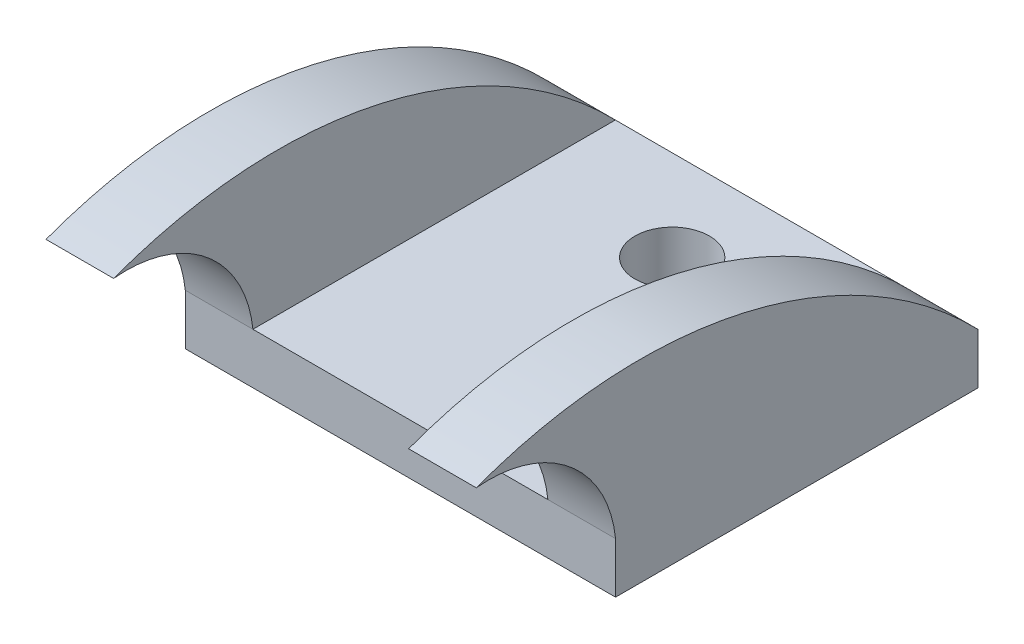
ISO-10303-21;
HEADER;
FILE_DESCRIPTION(('STEP AP214'),'2;1');
FILE_NAME('part.step','',(''),(''),'','','');
FILE_SCHEMA(('AUTOMOTIVE_DESIGN { 1 0 10303 214 1 1 1 1 }'));
ENDSEC;
DATA;
#1=APPLICATION_CONTEXT('core data for automotive mechanical design processes');
#2=APPLICATION_PROTOCOL_DEFINITION('international standard','automotive_design',2000,#1);
#3=PRODUCT_CONTEXT('',#1,'mechanical');
#4=PRODUCT('Part','Part','',(#3));
#5=PRODUCT_RELATED_PRODUCT_CATEGORY('part','',(#4));
#6=PRODUCT_DEFINITION_FORMATION('','',#4);
#7=PRODUCT_DEFINITION_CONTEXT('part definition',#1,'design');
#8=PRODUCT_DEFINITION('design','',#6,#7);
#9=PRODUCT_DEFINITION_SHAPE('','',#8);
#10=(LENGTH_UNIT() NAMED_UNIT(*) SI_UNIT(.MILLI.,.METRE.));
#11=(NAMED_UNIT(*) PLANE_ANGLE_UNIT() SI_UNIT($,.RADIAN.));
#12=(NAMED_UNIT(*) SI_UNIT($,.STERADIAN.) SOLID_ANGLE_UNIT());
#13=UNCERTAINTY_MEASURE_WITH_UNIT(LENGTH_MEASURE(1.E-05),#10,'distance_accuracy_value','');
#14=(GEOMETRIC_REPRESENTATION_CONTEXT(3) GLOBAL_UNCERTAINTY_ASSIGNED_CONTEXT((#13)) GLOBAL_UNIT_ASSIGNED_CONTEXT((#10,
#11,#12)) REPRESENTATION_CONTEXT('',''));
#15=CARTESIAN_POINT('',(0.,0.,0.));
#16=DIRECTION('',(0.,0.,1.));
#17=DIRECTION('',(1.,0.,0.));
#18=AXIS2_PLACEMENT_3D('',#15,#16,#17);
#19=CARTESIAN_POINT('',(0.,4.7625,0.));
#20=DIRECTION('',(0.,-1.,0.));
#21=DIRECTION('',(0.,0.,-1.));
#22=AXIS2_PLACEMENT_3D('',#19,#20,#21);
#23=PLANE('',#22);
#24=CARTESIAN_POINT('',(20.20062,4.7625,-25.5224165246659));
#25=DIRECTION('',(0.,1.,0.));
#26=DIRECTION('',(0.,0.,1.));
#27=AXIS2_PLACEMENT_3D('',#24,#25,#26);
#28=CIRCLE('',#27,3.5);
#29=CARTESIAN_POINT('',(20.20062,4.7625,-22.0224165246659));
#30=VERTEX_POINT('',#29);
#31=EDGE_CURVE('E161',#30,#30,#28,.T.);
#32=ORIENTED_EDGE('',*,*,#31,.F.);
#33=EDGE_LOOP('',(#32));
#34=FACE_BOUND('',#33,.T.);
#35=DIRECTION('',(-1.,0.,0.));
#36=VECTOR('',#35,1.);
#37=CARTESIAN_POINT('',(0.,4.7625,-34.036));
#38=LINE('',#37,#36);
#39=CARTESIAN_POINT('',(34.05124,4.7625,-34.036));
#40=VERTEX_POINT('',#39);
#41=CARTESIAN_POINT('',(6.35,4.7625,-34.036));
#42=VERTEX_POINT('',#41);
#43=EDGE_CURVE('E174',#40,#42,#38,.T.);
#44=ORIENTED_EDGE('',*,*,#43,.T.);
#45=DIRECTION('',(0.,0.,-1.));
#46=VECTOR('',#45,1.);
#47=CARTESIAN_POINT('',(6.35,4.7625,0.));
#48=LINE('',#47,#46);
#49=CARTESIAN_POINT('',(6.35,4.7625,0.));
#50=VERTEX_POINT('',#49);
#51=EDGE_CURVE('E57',#50,#42,#48,.T.);
#52=ORIENTED_EDGE('',*,*,#51,.F.);
#53=DIRECTION('',(1.,0.,0.));
#54=VECTOR('',#53,1.);
#55=CARTESIAN_POINT('',(0.,4.7625,0.));
#56=LINE('',#55,#54);
#57=CARTESIAN_POINT('',(34.05124,4.7625,0.));
#58=VERTEX_POINT('',#57);
#59=EDGE_CURVE('E175',#50,#58,#56,.T.);
#60=ORIENTED_EDGE('',*,*,#59,.T.);
#61=DIRECTION('',(0.,0.,-1.));
#62=VECTOR('',#61,1.);
#63=CARTESIAN_POINT('',(34.05124,4.7625,0.));
#64=LINE('',#63,#62);
#65=EDGE_CURVE('E149',#58,#40,#64,.T.);
#66=ORIENTED_EDGE('',*,*,#65,.T.);
#67=EDGE_LOOP('',(#44,#52,#60,#66));
#68=FACE_BOUND('',#67,.T.);
#69=ADVANCED_FACE('F41',(#34,#68),#23,.F.);
#70=CARTESIAN_POINT('',(0.,0.,0.));
#71=DIRECTION('',(0.,-1.,0.));
#72=DIRECTION('',(0.,0.,-1.));
#73=AXIS2_PLACEMENT_3D('',#70,#71,#72);
#74=PLANE('',#73);
#75=CARTESIAN_POINT('',(20.20062,0.,-25.5224165246659));
#76=DIRECTION('',(0.,1.,0.));
#77=DIRECTION('',(0.,0.,1.));
#78=AXIS2_PLACEMENT_3D('',#75,#76,#77);
#79=CIRCLE('',#78,3.5);
#80=CARTESIAN_POINT('',(20.20062,0.,-22.0224165246659));
#81=VERTEX_POINT('',#80);
#82=EDGE_CURVE('E167',#81,#81,#79,.T.);
#83=ORIENTED_EDGE('',*,*,#82,.T.);
#84=EDGE_LOOP('',(#83));
#85=FACE_BOUND('',#84,.T.);
#86=DIRECTION('',(0.,0.,1.));
#87=VECTOR('',#86,1.);
#88=CARTESIAN_POINT('',(0.,0.,0.));
#89=LINE('',#88,#87);
#90=CARTESIAN_POINT('',(0.,0.,-34.036));
#91=VERTEX_POINT('',#90);
#92=CARTESIAN_POINT('',(0.,0.,0.));
#93=VERTEX_POINT('',#92);
#94=EDGE_CURVE('E171',#91,#93,#89,.T.);
#95=ORIENTED_EDGE('',*,*,#94,.F.);
#96=DIRECTION('',(-1.,0.,0.));
#97=VECTOR('',#96,1.);
#98=CARTESIAN_POINT('',(0.,0.,-34.036));
#99=LINE('',#98,#97);
#100=CARTESIAN_POINT('',(40.40124,0.,-34.036));
#101=VERTEX_POINT('',#100);
#102=EDGE_CURVE('E190',#101,#91,#99,.T.);
#103=ORIENTED_EDGE('',*,*,#102,.F.);
#104=DIRECTION('',(0.,0.,-1.));
#105=VECTOR('',#104,1.);
#106=CARTESIAN_POINT('',(40.40124,0.,0.));
#107=LINE('',#106,#105);
#108=CARTESIAN_POINT('',(40.40124,0.,0.));
#109=VERTEX_POINT('',#108);
#110=EDGE_CURVE('E187',#109,#101,#107,.T.);
#111=ORIENTED_EDGE('',*,*,#110,.F.);
#112=DIRECTION('',(1.,0.,0.));
#113=VECTOR('',#112,1.);
#114=CARTESIAN_POINT('',(0.,0.,0.));
#115=LINE('',#114,#113);
#116=EDGE_CURVE('E184',#93,#109,#115,.T.);
#117=ORIENTED_EDGE('',*,*,#116,.F.);
#118=EDGE_LOOP('',(#95,#103,#111,#117));
#119=FACE_BOUND('',#118,.T.);
#120=ADVANCED_FACE('F210',(#85,#119),#74,.T.);
#121=CARTESIAN_POINT('',(0.,4.7625,0.));
#122=DIRECTION('',(1.,0.,0.));
#123=DIRECTION('',(0.,0.,-1.));
#124=AXIS2_PLACEMENT_3D('',#121,#122,#123);
#125=PLANE('',#124);
#126=ORIENTED_EDGE('',*,*,#94,.T.);
#127=DIRECTION('',(0.,-1.,0.));
#128=VECTOR('',#127,1.);
#129=CARTESIAN_POINT('',(0.,4.7625,0.));
#130=LINE('',#129,#128);
#131=CARTESIAN_POINT('',(0.,4.7625,0.));
#132=VERTEX_POINT('',#131);
#133=EDGE_CURVE('E11',#132,#93,#130,.T.);
#134=ORIENTED_EDGE('',*,*,#133,.F.);
#135=CARTESIAN_POINT('',(0.,3.49991612378801,11.924597944122));
#136=DIRECTION('',(-1.,0.,0.));
#137=DIRECTION('',(0.,0.,1.));
#138=AXIS2_PLACEMENT_3D('',#135,#136,#137);
#139=CIRCLE('',#138,11.991253236148);
#140=CARTESIAN_POINT('',(0.,15.4354816597309,13.0789070494494));
#141=VERTEX_POINT('',#140);
#142=EDGE_CURVE('E124',#141,#132,#139,.T.);
#143=ORIENTED_EDGE('',*,*,#142,.F.);
#144=CARTESIAN_POINT('',(0.,-26.0443619029989,-2.29096074080328));
#145=DIRECTION('',(1.,0.,0.));
#146=DIRECTION('',(0.,0.,1.));
#147=AXIS2_PLACEMENT_3D('',#144,#145,#146);
#148=CIRCLE('',#147,44.2358481085012);
#149=CARTESIAN_POINT('',(0.,4.7625,-34.036));
#150=VERTEX_POINT('',#149);
#151=EDGE_CURVE('E128',#150,#141,#148,.T.);
#152=ORIENTED_EDGE('',*,*,#151,.F.);
#153=DIRECTION('',(0.,-1.,0.));
#154=VECTOR('',#153,1.);
#155=CARTESIAN_POINT('',(0.,4.7625,-34.036));
#156=LINE('',#155,#154);
#157=EDGE_CURVE('E180',#150,#91,#156,.T.);
#158=ORIENTED_EDGE('',*,*,#157,.T.);
#159=EDGE_LOOP('',(#126,#134,#143,#152,#158));
#160=FACE_BOUND('',#159,.T.);
#161=ADVANCED_FACE('F43',(#160),#125,.F.);
#162=CARTESIAN_POINT('',(0.,4.7625,0.));
#163=DIRECTION('',(0.,0.,-1.));
#164=DIRECTION('',(-1.,0.,0.));
#165=AXIS2_PLACEMENT_3D('',#162,#163,#164);
#166=PLANE('',#165);
#167=ORIENTED_EDGE('',*,*,#116,.T.);
#168=DIRECTION('',(0.,-1.,0.));
#169=VECTOR('',#168,1.);
#170=CARTESIAN_POINT('',(40.40124,4.7625,0.));
#171=LINE('',#170,#169);
#172=CARTESIAN_POINT('',(40.40124,4.7625,0.));
#173=VERTEX_POINT('',#172);
#174=EDGE_CURVE('E50',#173,#109,#171,.T.);
#175=ORIENTED_EDGE('',*,*,#174,.F.);
#176=DIRECTION('',(1.,0.,0.));
#177=VECTOR('',#176,1.);
#178=CARTESIAN_POINT('',(34.05124,4.7625,0.));
#179=LINE('',#178,#177);
#180=EDGE_CURVE('E157',#58,#173,#179,.T.);
#181=ORIENTED_EDGE('',*,*,#180,.F.);
#182=ORIENTED_EDGE('',*,*,#59,.F.);
#183=EDGE_CURVE('E115',#132,#50,#56,.T.);
#184=ORIENTED_EDGE('',*,*,#183,.F.);
#185=ORIENTED_EDGE('',*,*,#133,.T.);
#186=EDGE_LOOP('',(#167,#175,#181,#182,#184,#185));
#187=FACE_BOUND('',#186,.T.);
#188=ADVANCED_FACE('F219',(#187),#166,.F.);
#189=CARTESIAN_POINT('',(40.40124,4.7625,0.));
#190=DIRECTION('',(-1.,0.,0.));
#191=DIRECTION('',(0.,0.,1.));
#192=AXIS2_PLACEMENT_3D('',#189,#190,#191);
#193=PLANE('',#192);
#194=ORIENTED_EDGE('',*,*,#110,.T.);
#195=DIRECTION('',(0.,-1.,0.));
#196=VECTOR('',#195,1.);
#197=CARTESIAN_POINT('',(40.40124,4.7625,-34.036));
#198=LINE('',#197,#196);
#199=CARTESIAN_POINT('',(40.40124,4.7625,-34.036));
#200=VERTEX_POINT('',#199);
#201=EDGE_CURVE('E196',#200,#101,#198,.T.);
#202=ORIENTED_EDGE('',*,*,#201,.F.);
#203=CARTESIAN_POINT('',(40.40124,-26.0443619029989,-2.29096074080328));
#204=DIRECTION('',(1.,0.,0.));
#205=DIRECTION('',(0.,0.,1.));
#206=AXIS2_PLACEMENT_3D('',#203,#204,#205);
#207=CIRCLE('',#206,44.2358481085012);
#208=CARTESIAN_POINT('',(40.40124,15.4354816597309,13.0789070494494));
#209=VERTEX_POINT('',#208);
#210=EDGE_CURVE('E130',#200,#209,#207,.T.);
#211=ORIENTED_EDGE('',*,*,#210,.T.);
#212=CARTESIAN_POINT('',(40.40124,3.49991612378801,11.924597944122));
#213=DIRECTION('',(-1.,0.,0.));
#214=DIRECTION('',(0.,0.,1.));
#215=AXIS2_PLACEMENT_3D('',#212,#213,#214);
#216=CIRCLE('',#215,11.991253236148);
#217=EDGE_CURVE('E135',#209,#173,#216,.T.);
#218=ORIENTED_EDGE('',*,*,#217,.T.);
#219=ORIENTED_EDGE('',*,*,#174,.T.);
#220=EDGE_LOOP('',(#194,#202,#211,#218,#219));
#221=FACE_BOUND('',#220,.T.);
#222=ADVANCED_FACE('F203',(#221),#193,.F.);
#223=CARTESIAN_POINT('',(0.,4.7625,-34.036));
#224=DIRECTION('',(0.,0.,1.));
#225=DIRECTION('',(1.,0.,0.));
#226=AXIS2_PLACEMENT_3D('',#223,#224,#225);
#227=PLANE('',#226);
#228=ORIENTED_EDGE('',*,*,#102,.T.);
#229=ORIENTED_EDGE('',*,*,#157,.F.);
#230=DIRECTION('',(-1.,0.,0.));
#231=VECTOR('',#230,1.);
#232=CARTESIAN_POINT('',(6.35,4.7625,-34.036));
#233=LINE('',#232,#231);
#234=EDGE_CURVE('E65',#42,#150,#233,.T.);
#235=ORIENTED_EDGE('',*,*,#234,.F.);
#236=ORIENTED_EDGE('',*,*,#43,.F.);
#237=EDGE_CURVE('E176',#200,#40,#38,.T.);
#238=ORIENTED_EDGE('',*,*,#237,.F.);
#239=ORIENTED_EDGE('',*,*,#201,.T.);
#240=EDGE_LOOP('',(#228,#229,#235,#236,#238,#239));
#241=FACE_BOUND('',#240,.T.);
#242=ADVANCED_FACE('F211',(#241),#227,.F.);
#243=CARTESIAN_POINT('',(20.20062,4.7625,-25.5224165246659));
#244=DIRECTION('',(0.,1.,0.));
#245=DIRECTION('',(0.,0.,1.));
#246=AXIS2_PLACEMENT_3D('',#243,#244,#245);
#247=CYLINDRICAL_SURFACE('',#246,3.5);
#248=ORIENTED_EDGE('',*,*,#82,.F.);
#249=EDGE_LOOP('',(#248));
#250=FACE_BOUND('',#249,.T.);
#251=ORIENTED_EDGE('',*,*,#31,.T.);
#252=EDGE_LOOP('',(#251));
#253=FACE_BOUND('',#252,.T.);
#254=ADVANCED_FACE('F250',(#250,#253),#247,.F.);
#255=CARTESIAN_POINT('',(34.05124,-26.0443619029989,-2.29096074080328));
#256=DIRECTION('',(1.,0.,0.));
#257=DIRECTION('',(0.,0.,-1.));
#258=AXIS2_PLACEMENT_3D('',#255,#256,#257);
#259=CYLINDRICAL_SURFACE('',#258,44.2358481085012);
#260=ORIENTED_EDGE('',*,*,#210,.F.);
#261=ORIENTED_EDGE('',*,*,#237,.T.);
#262=CARTESIAN_POINT('',(34.05124,-26.0443619029989,-2.29096074080328));
#263=DIRECTION('',(1.,0.,0.));
#264=DIRECTION('',(0.,0.,1.));
#265=AXIS2_PLACEMENT_3D('',#262,#263,#264);
#266=CIRCLE('',#265,44.2358481085012);
#267=CARTESIAN_POINT('',(34.05124,15.4354816597309,13.0789070494494));
#268=VERTEX_POINT('',#267);
#269=EDGE_CURVE('E141',#40,#268,#266,.T.);
#270=ORIENTED_EDGE('',*,*,#269,.T.);
#271=DIRECTION('',(1.,0.,0.));
#272=VECTOR('',#271,1.);
#273=CARTESIAN_POINT('',(34.05124,15.4354816597309,13.0789070494494));
#274=LINE('',#273,#272);
#275=EDGE_CURVE('E152',#268,#209,#274,.T.);
#276=ORIENTED_EDGE('',*,*,#275,.T.);
#277=EDGE_LOOP('',(#260,#261,#270,#276));
#278=FACE_BOUND('',#277,.T.);
#279=ADVANCED_FACE('F226',(#278),#259,.T.);
#280=CARTESIAN_POINT('',(34.05124,3.49991612378801,11.924597944122));
#281=DIRECTION('',(1.,0.,0.));
#282=DIRECTION('',(0.,0.,-1.));
#283=AXIS2_PLACEMENT_3D('',#280,#281,#282);
#284=CYLINDRICAL_SURFACE('',#283,11.991253236148);
#285=ORIENTED_EDGE('',*,*,#217,.F.);
#286=ORIENTED_EDGE('',*,*,#275,.F.);
#287=CARTESIAN_POINT('',(34.05124,3.49991612378801,11.924597944122));
#288=DIRECTION('',(-1.,0.,0.));
#289=DIRECTION('',(0.,0.,1.));
#290=AXIS2_PLACEMENT_3D('',#287,#288,#289);
#291=CIRCLE('',#290,11.991253236148);
#292=EDGE_CURVE('E145',#268,#58,#291,.T.);
#293=ORIENTED_EDGE('',*,*,#292,.T.);
#294=ORIENTED_EDGE('',*,*,#180,.T.);
#295=EDGE_LOOP('',(#285,#286,#293,#294));
#296=FACE_BOUND('',#295,.T.);
#297=ADVANCED_FACE('F229',(#296),#284,.F.);
#298=CARTESIAN_POINT('',(34.05124,-26.0443619029989,-2.29096074080328));
#299=DIRECTION('',(-1.,0.,0.));
#300=DIRECTION('',(0.,0.,1.));
#301=AXIS2_PLACEMENT_3D('',#298,#299,#300);
#302=PLANE('',#301);
#303=ORIENTED_EDGE('',*,*,#269,.F.);
#304=ORIENTED_EDGE('',*,*,#65,.F.);
#305=ORIENTED_EDGE('',*,*,#292,.F.);
#306=EDGE_LOOP('',(#303,#304,#305));
#307=FACE_BOUND('',#306,.T.);
#308=ADVANCED_FACE('F231',(#307),#302,.T.);
#309=CARTESIAN_POINT('',(6.35,-26.0443619029989,-2.29096074080328));
#310=DIRECTION('',(-1.,0.,0.));
#311=DIRECTION('',(0.,0.,1.));
#312=AXIS2_PLACEMENT_3D('',#309,#310,#311);
#313=CYLINDRICAL_SURFACE('',#312,44.2358481085012);
#314=ORIENTED_EDGE('',*,*,#151,.T.);
#315=DIRECTION('',(-1.,0.,0.));
#316=VECTOR('',#315,1.);
#317=CARTESIAN_POINT('',(6.35,15.4354816597309,13.0789070494494));
#318=LINE('',#317,#316);
#319=CARTESIAN_POINT('',(6.35,15.4354816597309,13.0789070494494));
#320=VERTEX_POINT('',#319);
#321=EDGE_CURVE('E113',#320,#141,#318,.T.);
#322=ORIENTED_EDGE('',*,*,#321,.F.);
#323=CARTESIAN_POINT('',(6.35,-26.0443619029989,-2.29096074080328));
#324=DIRECTION('',(1.,0.,0.));
#325=DIRECTION('',(0.,0.,1.));
#326=AXIS2_PLACEMENT_3D('',#323,#324,#325);
#327=CIRCLE('',#326,44.2358481085012);
#328=EDGE_CURVE('E120',#42,#320,#327,.T.);
#329=ORIENTED_EDGE('',*,*,#328,.F.);
#330=ORIENTED_EDGE('',*,*,#234,.T.);
#331=EDGE_LOOP('',(#314,#322,#329,#330));
#332=FACE_BOUND('',#331,.T.);
#333=ADVANCED_FACE('F126',(#332),#313,.T.);
#334=CARTESIAN_POINT('',(6.35,3.49991612378801,11.924597944122));
#335=DIRECTION('',(-1.,0.,0.));
#336=DIRECTION('',(0.,0.,1.));
#337=AXIS2_PLACEMENT_3D('',#334,#335,#336);
#338=CYLINDRICAL_SURFACE('',#337,11.991253236148);
#339=ORIENTED_EDGE('',*,*,#142,.T.);
#340=ORIENTED_EDGE('',*,*,#183,.T.);
#341=CARTESIAN_POINT('',(6.35,3.49991612378801,11.924597944122));
#342=DIRECTION('',(-1.,0.,0.));
#343=DIRECTION('',(0.,0.,1.));
#344=AXIS2_PLACEMENT_3D('',#341,#342,#343);
#345=CIRCLE('',#344,11.991253236148);
#346=EDGE_CURVE('E108',#320,#50,#345,.T.);
#347=ORIENTED_EDGE('',*,*,#346,.F.);
#348=ORIENTED_EDGE('',*,*,#321,.T.);
#349=EDGE_LOOP('',(#339,#340,#347,#348));
#350=FACE_BOUND('',#349,.T.);
#351=ADVANCED_FACE('F111',(#350),#338,.F.);
#352=CARTESIAN_POINT('',(6.35,-26.0443619029989,-2.29096074080328));
#353=DIRECTION('',(1.,0.,0.));
#354=DIRECTION('',(0.,0.,1.));
#355=AXIS2_PLACEMENT_3D('',#352,#353,#354);
#356=PLANE('',#355);
#357=ORIENTED_EDGE('',*,*,#328,.T.);
#358=ORIENTED_EDGE('',*,*,#346,.T.);
#359=ORIENTED_EDGE('',*,*,#51,.T.);
#360=EDGE_LOOP('',(#357,#358,#359));
#361=FACE_BOUND('',#360,.T.);
#362=ADVANCED_FACE('F121',(#361),#356,.T.);
#363=CLOSED_SHELL('',(#69,#120,#161,#188,#222,#242,#254,#279,#297,#308,#333,#351,#362));
#364=MANIFOLD_SOLID_BREP('B2',#363);
#365=ADVANCED_BREP_SHAPE_REPRESENTATION('',(#18,#364),#14);
#366=SHAPE_DEFINITION_REPRESENTATION(#9,#365);
ENDSEC;
END-ISO-10303-21;
